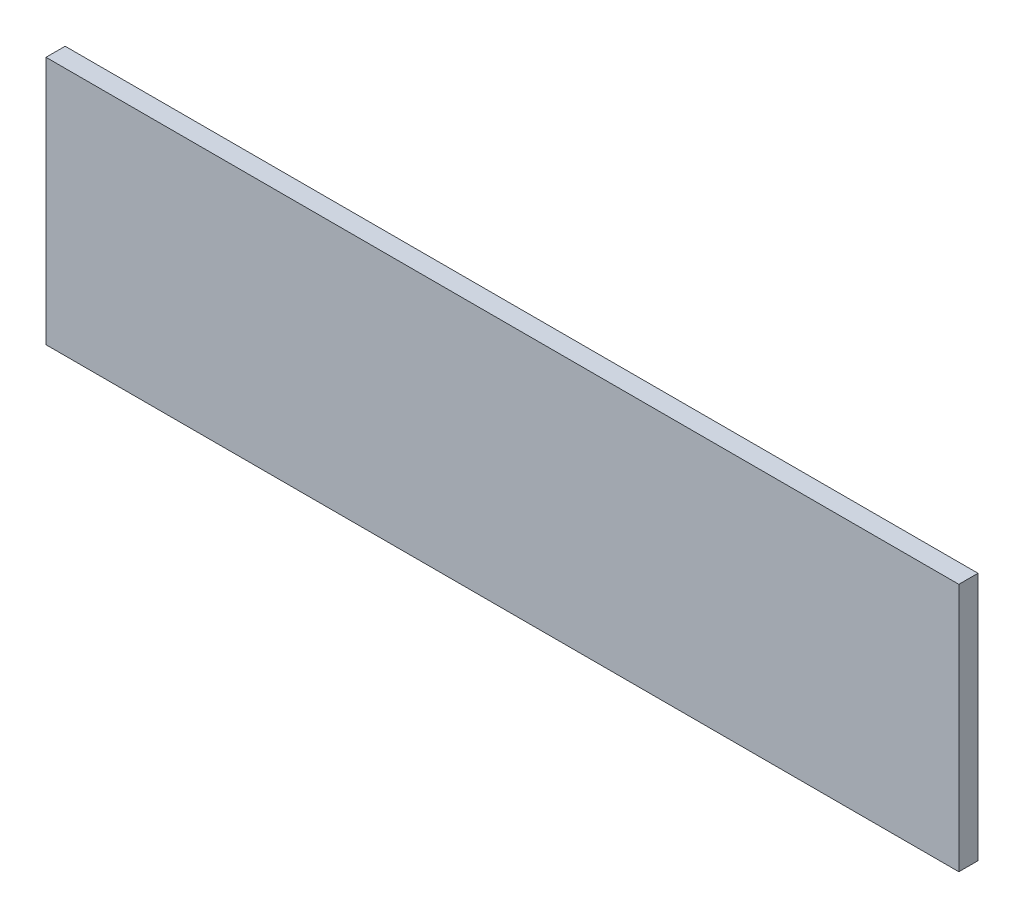
ISO-10303-21;
HEADER;
FILE_DESCRIPTION(('STEP AP214'),'2;1');
FILE_NAME('part.step','',(''),(''),'','','');
FILE_SCHEMA(('AUTOMOTIVE_DESIGN { 1 0 10303 214 1 1 1 1 }'));
ENDSEC;
DATA;
#1=APPLICATION_CONTEXT('core data for automotive mechanical design processes');
#2=APPLICATION_PROTOCOL_DEFINITION('international standard','automotive_design',2000,#1);
#3=PRODUCT_CONTEXT('',#1,'mechanical');
#4=PRODUCT('Part','Part','',(#3));
#5=PRODUCT_RELATED_PRODUCT_CATEGORY('part','',(#4));
#6=PRODUCT_DEFINITION_FORMATION('','',#4);
#7=PRODUCT_DEFINITION_CONTEXT('part definition',#1,'design');
#8=PRODUCT_DEFINITION('design','',#6,#7);
#9=PRODUCT_DEFINITION_SHAPE('','',#8);
#10=(LENGTH_UNIT() NAMED_UNIT(*) SI_UNIT(.MILLI.,.METRE.));
#11=(NAMED_UNIT(*) PLANE_ANGLE_UNIT() SI_UNIT($,.RADIAN.));
#12=(NAMED_UNIT(*) SI_UNIT($,.STERADIAN.) SOLID_ANGLE_UNIT());
#13=UNCERTAINTY_MEASURE_WITH_UNIT(LENGTH_MEASURE(1.E-05),#10,'distance_accuracy_value','');
#14=(GEOMETRIC_REPRESENTATION_CONTEXT(3) GLOBAL_UNCERTAINTY_ASSIGNED_CONTEXT((#13)) GLOBAL_UNIT_ASSIGNED_CONTEXT((#10,
#11,#12)) REPRESENTATION_CONTEXT('',''));
#15=CARTESIAN_POINT('',(0.,0.,0.));
#16=DIRECTION('',(0.,0.,1.));
#17=DIRECTION('',(1.,0.,0.));
#18=AXIS2_PLACEMENT_3D('',#15,#16,#17);
#19=CARTESIAN_POINT('',(143.,-39.,6.));
#20=DIRECTION('',(-1.,0.,0.));
#21=DIRECTION('',(0.,0.,1.));
#22=AXIS2_PLACEMENT_3D('',#19,#20,#21);
#23=PLANE('',#22);
#24=DIRECTION('',(0.,1.,0.));
#25=VECTOR('',#24,1.);
#26=CARTESIAN_POINT('',(143.,-39.,0.));
#27=LINE('',#26,#25);
#28=CARTESIAN_POINT('',(143.,-39.,0.));
#29=VERTEX_POINT('',#28);
#30=CARTESIAN_POINT('',(143.,39.,0.));
#31=VERTEX_POINT('',#30);
#32=EDGE_CURVE('E96',#29,#31,#27,.T.);
#33=ORIENTED_EDGE('',*,*,#32,.T.);
#34=DIRECTION('',(0.,0.,-1.));
#35=VECTOR('',#34,1.);
#36=CARTESIAN_POINT('',(143.,39.,6.));
#37=LINE('',#36,#35);
#38=CARTESIAN_POINT('',(143.,39.,6.));
#39=VERTEX_POINT('',#38);
#40=EDGE_CURVE('E11',#39,#31,#37,.T.);
#41=ORIENTED_EDGE('',*,*,#40,.F.);
#42=DIRECTION('',(0.,1.,0.));
#43=VECTOR('',#42,1.);
#44=CARTESIAN_POINT('',(143.,-39.,6.));
#45=LINE('',#44,#43);
#46=CARTESIAN_POINT('',(143.,-39.,6.));
#47=VERTEX_POINT('',#46);
#48=EDGE_CURVE('E84',#47,#39,#45,.T.);
#49=ORIENTED_EDGE('',*,*,#48,.F.);
#50=DIRECTION('',(0.,0.,-1.));
#51=VECTOR('',#50,1.);
#52=CARTESIAN_POINT('',(143.,-39.,6.));
#53=LINE('',#52,#51);
#54=EDGE_CURVE('E92',#47,#29,#53,.T.);
#55=ORIENTED_EDGE('',*,*,#54,.T.);
#56=EDGE_LOOP('',(#33,#41,#49,#55));
#57=FACE_BOUND('',#56,.T.);
#58=ADVANCED_FACE('F33',(#57),#23,.F.);
#59=CARTESIAN_POINT('',(-143.,39.,6.));
#60=DIRECTION('',(0.,-1.,0.));
#61=DIRECTION('',(0.,0.,-1.));
#62=AXIS2_PLACEMENT_3D('',#59,#60,#61);
#63=PLANE('',#62);
#64=DIRECTION('',(-1.,0.,0.));
#65=VECTOR('',#64,1.);
#66=CARTESIAN_POINT('',(-143.,39.,0.));
#67=LINE('',#66,#65);
#68=CARTESIAN_POINT('',(-143.,39.,0.));
#69=VERTEX_POINT('',#68);
#70=EDGE_CURVE('E88',#31,#69,#67,.T.);
#71=ORIENTED_EDGE('',*,*,#70,.T.);
#72=DIRECTION('',(0.,0.,-1.));
#73=VECTOR('',#72,1.);
#74=CARTESIAN_POINT('',(-143.,39.,6.));
#75=LINE('',#74,#73);
#76=CARTESIAN_POINT('',(-143.,39.,6.));
#77=VERTEX_POINT('',#76);
#78=EDGE_CURVE('E41',#77,#69,#75,.T.);
#79=ORIENTED_EDGE('',*,*,#78,.F.);
#80=DIRECTION('',(-1.,0.,0.));
#81=VECTOR('',#80,1.);
#82=CARTESIAN_POINT('',(-143.,39.,6.));
#83=LINE('',#82,#81);
#84=EDGE_CURVE('E79',#39,#77,#83,.T.);
#85=ORIENTED_EDGE('',*,*,#84,.F.);
#86=ORIENTED_EDGE('',*,*,#40,.T.);
#87=EDGE_LOOP('',(#71,#79,#85,#86));
#88=FACE_BOUND('',#87,.T.);
#89=ADVANCED_FACE('F87',(#88),#63,.F.);
#90=CARTESIAN_POINT('',(-143.,-39.,6.));
#91=DIRECTION('',(1.,0.,0.));
#92=DIRECTION('',(0.,0.,-1.));
#93=AXIS2_PLACEMENT_3D('',#90,#91,#92);
#94=PLANE('',#93);
#95=DIRECTION('',(0.,-1.,0.));
#96=VECTOR('',#95,1.);
#97=CARTESIAN_POINT('',(-143.,-39.,0.));
#98=LINE('',#97,#96);
#99=CARTESIAN_POINT('',(-143.,-39.,0.));
#100=VERTEX_POINT('',#99);
#101=EDGE_CURVE('E66',#69,#100,#98,.T.);
#102=ORIENTED_EDGE('',*,*,#101,.T.);
#103=DIRECTION('',(0.,0.,-1.));
#104=VECTOR('',#103,1.);
#105=CARTESIAN_POINT('',(-143.,-39.,6.));
#106=LINE('',#105,#104);
#107=CARTESIAN_POINT('',(-143.,-39.,6.));
#108=VERTEX_POINT('',#107);
#109=EDGE_CURVE('E89',#108,#100,#106,.T.);
#110=ORIENTED_EDGE('',*,*,#109,.F.);
#111=DIRECTION('',(0.,-1.,0.));
#112=VECTOR('',#111,1.);
#113=CARTESIAN_POINT('',(-143.,-39.,6.));
#114=LINE('',#113,#112);
#115=EDGE_CURVE('E82',#77,#108,#114,.T.);
#116=ORIENTED_EDGE('',*,*,#115,.F.);
#117=ORIENTED_EDGE('',*,*,#78,.T.);
#118=EDGE_LOOP('',(#102,#110,#116,#117));
#119=FACE_BOUND('',#118,.T.);
#120=ADVANCED_FACE('F90',(#119),#94,.F.);
#121=CARTESIAN_POINT('',(-143.,-39.,6.));
#122=DIRECTION('',(0.,1.,0.));
#123=DIRECTION('',(0.,0.,1.));
#124=AXIS2_PLACEMENT_3D('',#121,#122,#123);
#125=PLANE('',#124);
#126=DIRECTION('',(1.,0.,0.));
#127=VECTOR('',#126,1.);
#128=CARTESIAN_POINT('',(-143.,-39.,0.));
#129=LINE('',#128,#127);
#130=EDGE_CURVE('E72',#100,#29,#129,.T.);
#131=ORIENTED_EDGE('',*,*,#130,.T.);
#132=ORIENTED_EDGE('',*,*,#54,.F.);
#133=DIRECTION('',(1.,0.,0.));
#134=VECTOR('',#133,1.);
#135=CARTESIAN_POINT('',(-143.,-39.,6.));
#136=LINE('',#135,#134);
#137=EDGE_CURVE('E49',#108,#47,#136,.T.);
#138=ORIENTED_EDGE('',*,*,#137,.F.);
#139=ORIENTED_EDGE('',*,*,#109,.T.);
#140=EDGE_LOOP('',(#131,#132,#138,#139));
#141=FACE_BOUND('',#140,.T.);
#142=ADVANCED_FACE('F103',(#141),#125,.F.);
#143=CARTESIAN_POINT('',(0.,0.,6.));
#144=DIRECTION('',(0.,0.,-1.));
#145=DIRECTION('',(-1.,0.,0.));
#146=AXIS2_PLACEMENT_3D('',#143,#144,#145);
#147=PLANE('',#146);
#148=ORIENTED_EDGE('',*,*,#48,.T.);
#149=ORIENTED_EDGE('',*,*,#84,.T.);
#150=ORIENTED_EDGE('',*,*,#115,.T.);
#151=ORIENTED_EDGE('',*,*,#137,.T.);
#152=EDGE_LOOP('',(#148,#149,#150,#151));
#153=FACE_BOUND('',#152,.T.);
#154=ADVANCED_FACE('F80',(#153),#147,.F.);
#155=CARTESIAN_POINT('',(0.,0.,0.));
#156=DIRECTION('',(0.,0.,-1.));
#157=DIRECTION('',(-1.,0.,0.));
#158=AXIS2_PLACEMENT_3D('',#155,#156,#157);
#159=PLANE('',#158);
#160=ORIENTED_EDGE('',*,*,#32,.F.);
#161=ORIENTED_EDGE('',*,*,#130,.F.);
#162=ORIENTED_EDGE('',*,*,#101,.F.);
#163=ORIENTED_EDGE('',*,*,#70,.F.);
#164=EDGE_LOOP('',(#160,#161,#162,#163));
#165=FACE_BOUND('',#164,.T.);
#166=ADVANCED_FACE('F106',(#165),#159,.T.);
#167=CLOSED_SHELL('',(#58,#89,#120,#142,#154,#166));
#168=MANIFOLD_SOLID_BREP('B2',#167);
#169=ADVANCED_BREP_SHAPE_REPRESENTATION('',(#18,#168),#14);
#170=SHAPE_DEFINITION_REPRESENTATION(#9,#169);
ENDSEC;
END-ISO-10303-21;
